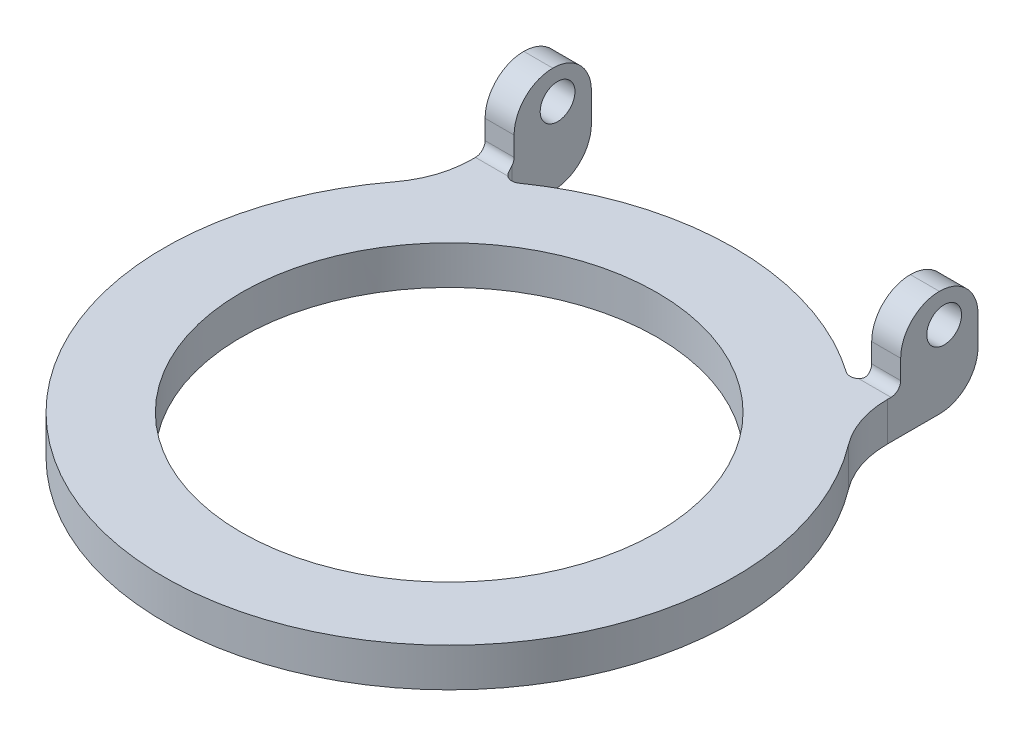
ISO-10303-21;
HEADER;
FILE_DESCRIPTION(('STEP AP214'),'2;1');
FILE_NAME('part.step','',(''),(''),'','','');
FILE_SCHEMA(('AUTOMOTIVE_DESIGN { 1 0 10303 214 1 1 1 1 }'));
ENDSEC;
DATA;
#1=APPLICATION_CONTEXT('core data for automotive mechanical design processes');
#2=APPLICATION_PROTOCOL_DEFINITION('international standard','automotive_design',2000,#1);
#3=PRODUCT_CONTEXT('',#1,'mechanical');
#4=PRODUCT('Part','Part','',(#3));
#5=PRODUCT_RELATED_PRODUCT_CATEGORY('part','',(#4));
#6=PRODUCT_DEFINITION_FORMATION('','',#4);
#7=PRODUCT_DEFINITION_CONTEXT('part definition',#1,'design');
#8=PRODUCT_DEFINITION('design','',#6,#7);
#9=PRODUCT_DEFINITION_SHAPE('','',#8);
#10=(LENGTH_UNIT() NAMED_UNIT(*) SI_UNIT(.MILLI.,.METRE.));
#11=(NAMED_UNIT(*) PLANE_ANGLE_UNIT() SI_UNIT($,.RADIAN.));
#12=(NAMED_UNIT(*) SI_UNIT($,.STERADIAN.) SOLID_ANGLE_UNIT());
#13=UNCERTAINTY_MEASURE_WITH_UNIT(LENGTH_MEASURE(1.E-05),#10,'distance_accuracy_value','');
#14=(GEOMETRIC_REPRESENTATION_CONTEXT(3) GLOBAL_UNCERTAINTY_ASSIGNED_CONTEXT((#13)) GLOBAL_UNIT_ASSIGNED_CONTEXT((#10,
#11,#12)) REPRESENTATION_CONTEXT('',''));
#15=CARTESIAN_POINT('',(0.,0.,0.));
#16=DIRECTION('',(0.,0.,1.));
#17=DIRECTION('',(1.,0.,0.));
#18=AXIS2_PLACEMENT_3D('',#15,#16,#17);
#19=CARTESIAN_POINT('',(0.,4.,0.));
#20=DIRECTION('',(0.,1.,0.));
#21=DIRECTION('',(0.,0.,1.));
#22=AXIS2_PLACEMENT_3D('',#19,#20,#21);
#23=PLANE('',#22);
#24=CARTESIAN_POINT('',(0.,4.,0.));
#25=DIRECTION('',(0.,1.,0.));
#26=DIRECTION('',(0.,0.,1.));
#27=AXIS2_PLACEMENT_3D('',#24,#25,#26);
#28=CIRCLE('',#27,21.5);
#29=CARTESIAN_POINT('',(0.,4.,21.5));
#30=VERTEX_POINT('',#29);
#31=EDGE_CURVE('E293',#30,#30,#28,.T.);
#32=ORIENTED_EDGE('',*,*,#31,.F.);
#33=EDGE_LOOP('',(#32));
#34=FACE_BOUND('',#33,.T.);
#35=CARTESIAN_POINT('',(-17.5,4.,-24.9799919935936));
#36=DIRECTION('',(0.,1.,0.));
#37=DIRECTION('',(0.,0.,1.));
#38=AXIS2_PLACEMENT_3D('',#35,#36,#37);
#39=CIRCLE('',#38,1.);
#40=CARTESIAN_POINT('',(-16.9262295081967,4.,-24.1609758626561));
#41=VERTEX_POINT('',#40);
#42=CARTESIAN_POINT('',(-18.1418997642347,4.,-24.2132034355964));
#43=VERTEX_POINT('',#42);
#44=EDGE_CURVE('E335',#41,#43,#39,.F.);
#45=ORIENTED_EDGE('',*,*,#44,.T.);
#46=DIRECTION('',(1.,0.,0.));
#47=VECTOR('',#46,1.);
#48=CARTESIAN_POINT('',(0.,4.,-24.2132034355964));
#49=LINE('',#48,#47);
#50=CARTESIAN_POINT('',(-21.5,4.,-24.2132034355964));
#51=VERTEX_POINT('',#50);
#52=EDGE_CURVE('E351',#43,#51,#49,.F.);
#53=ORIENTED_EDGE('',*,*,#52,.T.);
#54=DIRECTION('',(0.,0.,1.));
#55=VECTOR('',#54,1.);
#56=CARTESIAN_POINT('',(-21.5,4.,0.));
#57=LINE('',#56,#55);
#58=CARTESIAN_POINT('',(-21.5,4.,-23.832750575626));
#59=VERTEX_POINT('',#58);
#60=EDGE_CURVE('E402',#51,#59,#57,.T.);
#61=ORIENTED_EDGE('',*,*,#60,.T.);
#62=CARTESIAN_POINT('',(-31.5,4.,-23.832750575626));
#63=DIRECTION('',(0.,1.,0.));
#64=DIRECTION('',(0.,0.,1.));
#65=AXIS2_PLACEMENT_3D('',#62,#63,#64);
#66=CIRCLE('',#65,10.);
#67=CARTESIAN_POINT('',(-23.5253164556962,4.,-17.7991428349612));
#68=VERTEX_POINT('',#67);
#69=EDGE_CURVE('E318',#59,#68,#66,.F.);
#70=ORIENTED_EDGE('',*,*,#69,.T.);
#71=CARTESIAN_POINT('',(0.,4.,0.));
#72=DIRECTION('',(0.,1.,0.));
#73=DIRECTION('',(0.,0.,1.));
#74=AXIS2_PLACEMENT_3D('',#71,#72,#73);
#75=CIRCLE('',#74,29.5);
#76=CARTESIAN_POINT('',(23.5253164556962,4.,-17.7991428349612));
#77=VERTEX_POINT('',#76);
#78=EDGE_CURVE('E432',#68,#77,#75,.T.);
#79=ORIENTED_EDGE('',*,*,#78,.T.);
#80=CARTESIAN_POINT('',(31.5,4.,-23.832750575626));
#81=DIRECTION('',(0.,1.,0.));
#82=DIRECTION('',(0.,0.,1.));
#83=AXIS2_PLACEMENT_3D('',#80,#81,#82);
#84=CIRCLE('',#83,10.);
#85=CARTESIAN_POINT('',(21.5,4.,-23.832750575626));
#86=VERTEX_POINT('',#85);
#87=EDGE_CURVE('E311',#77,#86,#84,.F.);
#88=ORIENTED_EDGE('',*,*,#87,.T.);
#89=DIRECTION('',(0.,0.,1.));
#90=VECTOR('',#89,1.);
#91=CARTESIAN_POINT('',(21.5,4.,0.));
#92=LINE('',#91,#90);
#93=CARTESIAN_POINT('',(21.5,4.,-24.2132034355964));
#94=VERTEX_POINT('',#93);
#95=EDGE_CURVE('E435',#94,#86,#92,.T.);
#96=ORIENTED_EDGE('',*,*,#95,.F.);
#97=DIRECTION('',(1.,0.,0.));
#98=VECTOR('',#97,1.);
#99=CARTESIAN_POINT('',(0.,4.,-24.2132034355964));
#100=LINE('',#99,#98);
#101=CARTESIAN_POINT('',(18.1418997642347,4.,-24.2132034355964));
#102=VERTEX_POINT('',#101);
#103=EDGE_CURVE('E348',#94,#102,#100,.F.);
#104=ORIENTED_EDGE('',*,*,#103,.T.);
#105=CARTESIAN_POINT('',(17.5,4.,-24.9799919935936));
#106=DIRECTION('',(0.,1.,0.));
#107=DIRECTION('',(0.,0.,1.));
#108=AXIS2_PLACEMENT_3D('',#105,#106,#107);
#109=CIRCLE('',#108,1.);
#110=CARTESIAN_POINT('',(16.9262295081967,4.,-24.1609758626561));
#111=VERTEX_POINT('',#110);
#112=EDGE_CURVE('E341',#102,#111,#109,.F.);
#113=ORIENTED_EDGE('',*,*,#112,.T.);
#114=EDGE_CURVE('E219',#111,#41,#75,.T.);
#115=ORIENTED_EDGE('',*,*,#114,.T.);
#116=EDGE_LOOP('',(#45,#53,#61,#70,#79,#88,#96,#104,#113,#115));
#117=FACE_BOUND('',#116,.T.);
#118=ADVANCED_FACE('F47',(#34,#117),#23,.T.);
#119=CARTESIAN_POINT('',(0.,4.,0.));
#120=DIRECTION('',(0.,-1.,0.));
#121=DIRECTION('',(0.,0.,-1.));
#122=AXIS2_PLACEMENT_3D('',#119,#120,#121);
#123=CYLINDRICAL_SURFACE('',#122,29.5);
#124=CARTESIAN_POINT('',(0.,0.,0.));
#125=DIRECTION('',(0.,1.,0.));
#126=DIRECTION('',(0.,0.,1.));
#127=AXIS2_PLACEMENT_3D('',#124,#125,#126);
#128=CIRCLE('',#127,29.5);
#129=CARTESIAN_POINT('',(16.9262295081967,0.,-24.1609758626561));
#130=VERTEX_POINT('',#129);
#131=CARTESIAN_POINT('',(-16.9262295081967,0.,-24.1609758626561));
#132=VERTEX_POINT('',#131);
#133=EDGE_CURVE('E411',#130,#132,#128,.T.);
#134=ORIENTED_EDGE('',*,*,#133,.T.);
#135=DIRECTION('',(0.,-1.,0.));
#136=VECTOR('',#135,1.);
#137=CARTESIAN_POINT('',(-16.9262295081967,4.,-24.1609758626561));
#138=LINE('',#137,#136);
#139=EDGE_CURVE('E327',#132,#41,#138,.F.);
#140=ORIENTED_EDGE('',*,*,#139,.T.);
#141=ORIENTED_EDGE('',*,*,#114,.F.);
#142=DIRECTION('',(0.,-1.,0.));
#143=VECTOR('',#142,1.);
#144=CARTESIAN_POINT('',(16.9262295081967,4.,-24.1609758626561));
#145=LINE('',#144,#143);
#146=EDGE_CURVE('E323',#111,#130,#145,.T.);
#147=ORIENTED_EDGE('',*,*,#146,.T.);
#148=EDGE_LOOP('',(#134,#140,#141,#147));
#149=FACE_BOUND('',#148,.T.);
#150=ADVANCED_FACE('F550',(#149),#123,.T.);
#151=CARTESIAN_POINT('',(-18.5,4.,0.));
#152=DIRECTION('',(1.,0.,0.));
#153=DIRECTION('',(0.,0.,-1.));
#154=AXIS2_PLACEMENT_3D('',#151,#152,#153);
#155=PLANE('',#154);
#156=CARTESIAN_POINT('',(-18.5,7.75,-29.7132034355964));
#157=DIRECTION('',(1.,0.,0.));
#158=DIRECTION('',(0.,0.,-1.));
#159=AXIS2_PLACEMENT_3D('',#156,#157,#158);
#160=CIRCLE('',#159,1.8);
#161=CARTESIAN_POINT('',(-18.5,7.75,-31.5132034355964));
#162=VERTEX_POINT('',#161);
#163=EDGE_CURVE('E471',#162,#162,#160,.T.);
#164=ORIENTED_EDGE('',*,*,#163,.F.);
#165=EDGE_LOOP('',(#164));
#166=FACE_BOUND('',#165,.T.);
#167=DIRECTION('',(0.,-1.,0.));
#168=VECTOR('',#167,1.);
#169=CARTESIAN_POINT('',(-18.5,11.,-25.2132034355964));
#170=LINE('',#169,#168);
#171=CARTESIAN_POINT('',(-18.5,7.,-25.2132034355964));
#172=VERTEX_POINT('',#171);
#173=CARTESIAN_POINT('',(-18.5,5.,-25.2132034355964));
#174=VERTEX_POINT('',#173);
#175=EDGE_CURVE('E412',#172,#174,#170,.T.);
#176=ORIENTED_EDGE('',*,*,#175,.T.);
#177=CARTESIAN_POINT('',(-18.5,5.,-24.2132034355964));
#178=DIRECTION('',(1.,0.,0.));
#179=DIRECTION('',(0.,0.,-1.));
#180=AXIS2_PLACEMENT_3D('',#177,#178,#179);
#181=CIRCLE('',#180,1.);
#182=CARTESIAN_POINT('',(-18.5,4.35810023576526,-24.9799919935936));
#183=VERTEX_POINT('',#182);
#184=EDGE_CURVE('E358',#174,#183,#181,.F.);
#185=ORIENTED_EDGE('',*,*,#184,.T.);
#186=DIRECTION('',(0.,-1.,0.));
#187=VECTOR('',#186,1.);
#188=CARTESIAN_POINT('',(-18.5,4.,-24.9799919935936));
#189=LINE('',#188,#187);
#190=CARTESIAN_POINT('',(-18.5,0.,-24.9799919935936));
#191=VERTEX_POINT('',#190);
#192=EDGE_CURVE('E71',#183,#191,#189,.T.);
#193=ORIENTED_EDGE('',*,*,#192,.T.);
#194=DIRECTION('',(0.,0.,1.));
#195=VECTOR('',#194,1.);
#196=CARTESIAN_POINT('',(-18.5,0.,0.));
#197=LINE('',#196,#195);
#198=CARTESIAN_POINT('',(-18.5,0.,-29.2132034355964));
#199=VERTEX_POINT('',#198);
#200=EDGE_CURVE('E441',#199,#191,#197,.T.);
#201=ORIENTED_EDGE('',*,*,#200,.F.);
#202=CARTESIAN_POINT('',(-18.5,4.,-29.2132034355964));
#203=DIRECTION('',(1.,0.,0.));
#204=DIRECTION('',(0.,0.,-1.));
#205=AXIS2_PLACEMENT_3D('',#202,#203,#204);
#206=CIRCLE('',#205,4.);
#207=CARTESIAN_POINT('',(-18.5,4.,-33.2132034355964));
#208=VERTEX_POINT('',#207);
#209=EDGE_CURVE('E272',#199,#208,#206,.T.);
#210=ORIENTED_EDGE('',*,*,#209,.T.);
#211=DIRECTION('',(0.,-1.,0.));
#212=VECTOR('',#211,1.);
#213=CARTESIAN_POINT('',(-18.5,4.,-33.2132034355964));
#214=LINE('',#213,#212);
#215=CARTESIAN_POINT('',(-18.5,7.,-33.2132034355964));
#216=VERTEX_POINT('',#215);
#217=EDGE_CURVE('E232',#216,#208,#214,.T.);
#218=ORIENTED_EDGE('',*,*,#217,.F.);
#219=CARTESIAN_POINT('',(-18.5,7.,-29.2132034355964));
#220=DIRECTION('',(1.,0.,0.));
#221=DIRECTION('',(0.,0.,-1.));
#222=AXIS2_PLACEMENT_3D('',#219,#220,#221);
#223=CIRCLE('',#222,4.);
#224=CARTESIAN_POINT('',(-18.5,11.,-29.2132034355964));
#225=VERTEX_POINT('',#224);
#226=EDGE_CURVE('E266',#216,#225,#223,.T.);
#227=ORIENTED_EDGE('',*,*,#226,.T.);
#228=CARTESIAN_POINT('',(-18.5,7.,-29.2132034355964));
#229=DIRECTION('',(1.,0.,0.));
#230=DIRECTION('',(0.,0.,-1.));
#231=AXIS2_PLACEMENT_3D('',#228,#229,#230);
#232=CIRCLE('',#231,4.);
#233=EDGE_CURVE('E269',#225,#172,#232,.T.);
#234=ORIENTED_EDGE('',*,*,#233,.T.);
#235=EDGE_LOOP('',(#176,#185,#193,#201,#210,#218,#227,#234));
#236=FACE_BOUND('',#235,.T.);
#237=ADVANCED_FACE('F416',(#166,#236),#155,.T.);
#238=CARTESIAN_POINT('',(0.,4.,-33.2132034355964));
#239=DIRECTION('',(0.,0.,1.));
#240=DIRECTION('',(1.,0.,0.));
#241=AXIS2_PLACEMENT_3D('',#238,#239,#240);
#242=PLANE('',#241);
#243=ORIENTED_EDGE('',*,*,#217,.T.);
#244=DIRECTION('',(-1.,0.,0.));
#245=VECTOR('',#244,1.);
#246=CARTESIAN_POINT('',(0.,4.,-33.2132034355964));
#247=LINE('',#246,#245);
#248=CARTESIAN_POINT('',(-21.5,4.,-33.2132034355964));
#249=VERTEX_POINT('',#248);
#250=EDGE_CURVE('E253',#208,#249,#247,.T.);
#251=ORIENTED_EDGE('',*,*,#250,.T.);
#252=DIRECTION('',(0.,-1.,0.));
#253=VECTOR('',#252,1.);
#254=CARTESIAN_POINT('',(-21.5,4.,-33.2132034355964));
#255=LINE('',#254,#253);
#256=CARTESIAN_POINT('',(-21.5,7.,-33.2132034355964));
#257=VERTEX_POINT('',#256);
#258=EDGE_CURVE('E456',#257,#249,#255,.T.);
#259=ORIENTED_EDGE('',*,*,#258,.F.);
#260=DIRECTION('',(-1.,0.,0.));
#261=VECTOR('',#260,1.);
#262=CARTESIAN_POINT('',(-18.5,7.,-33.2132034355964));
#263=LINE('',#262,#261);
#264=EDGE_CURVE('E207',#257,#216,#263,.F.);
#265=ORIENTED_EDGE('',*,*,#264,.T.);
#266=EDGE_LOOP('',(#243,#251,#259,#265));
#267=FACE_BOUND('',#266,.T.);
#268=ADVANCED_FACE('F530',(#267),#242,.F.);
#269=CARTESIAN_POINT('',(-21.5,4.,0.));
#270=DIRECTION('',(1.,0.,0.));
#271=DIRECTION('',(0.,0.,-1.));
#272=AXIS2_PLACEMENT_3D('',#269,#270,#271);
#273=PLANE('',#272);
#274=CARTESIAN_POINT('',(-21.5,7.75,-29.7132034355964));
#275=DIRECTION('',(-1.,0.,0.));
#276=DIRECTION('',(0.,0.,1.));
#277=AXIS2_PLACEMENT_3D('',#274,#275,#276);
#278=CIRCLE('',#277,1.8);
#279=CARTESIAN_POINT('',(-21.5,7.75,-27.9132034355964));
#280=VERTEX_POINT('',#279);
#281=EDGE_CURVE('E288',#280,#280,#278,.T.);
#282=ORIENTED_EDGE('',*,*,#281,.F.);
#283=EDGE_LOOP('',(#282));
#284=FACE_BOUND('',#283,.T.);
#285=DIRECTION('',(0.,0.,1.));
#286=VECTOR('',#285,1.);
#287=CARTESIAN_POINT('',(-21.5,0.,0.));
#288=LINE('',#287,#286);
#289=CARTESIAN_POINT('',(-21.5,0.,-29.2132034355964));
#290=VERTEX_POINT('',#289);
#291=CARTESIAN_POINT('',(-21.5,0.,-23.832750575626));
#292=VERTEX_POINT('',#291);
#293=EDGE_CURVE('E445',#290,#292,#288,.T.);
#294=ORIENTED_EDGE('',*,*,#293,.T.);
#295=DIRECTION('',(0.,1.,0.));
#296=VECTOR('',#295,1.);
#297=CARTESIAN_POINT('',(-21.5,4.,-23.832750575626));
#298=LINE('',#297,#296);
#299=EDGE_CURVE('E304',#292,#59,#298,.T.);
#300=ORIENTED_EDGE('',*,*,#299,.T.);
#301=ORIENTED_EDGE('',*,*,#60,.F.);
#302=CARTESIAN_POINT('',(-21.5,5.,-24.2132034355964));
#303=DIRECTION('',(1.,0.,0.));
#304=DIRECTION('',(0.,0.,-1.));
#305=AXIS2_PLACEMENT_3D('',#302,#303,#304);
#306=CIRCLE('',#305,1.);
#307=CARTESIAN_POINT('',(-21.5,5.,-25.2132034355964));
#308=VERTEX_POINT('',#307);
#309=EDGE_CURVE('E369',#51,#308,#306,.T.);
#310=ORIENTED_EDGE('',*,*,#309,.T.);
#311=DIRECTION('',(0.,-1.,0.));
#312=VECTOR('',#311,1.);
#313=CARTESIAN_POINT('',(-21.5,11.,-25.2132034355964));
#314=LINE('',#313,#312);
#315=CARTESIAN_POINT('',(-21.5,7.,-25.2132034355964));
#316=VERTEX_POINT('',#315);
#317=EDGE_CURVE('E401',#316,#308,#314,.T.);
#318=ORIENTED_EDGE('',*,*,#317,.F.);
#319=CARTESIAN_POINT('',(-21.5,7.,-29.2132034355964));
#320=DIRECTION('',(1.,0.,0.));
#321=DIRECTION('',(0.,0.,-1.));
#322=AXIS2_PLACEMENT_3D('',#319,#320,#321);
#323=CIRCLE('',#322,4.);
#324=CARTESIAN_POINT('',(-21.5,11.,-29.2132034355964));
#325=VERTEX_POINT('',#324);
#326=EDGE_CURVE('E260',#316,#325,#323,.F.);
#327=ORIENTED_EDGE('',*,*,#326,.T.);
#328=CARTESIAN_POINT('',(-21.5,7.,-29.2132034355964));
#329=DIRECTION('',(1.,0.,0.));
#330=DIRECTION('',(0.,0.,-1.));
#331=AXIS2_PLACEMENT_3D('',#328,#329,#330);
#332=CIRCLE('',#331,4.);
#333=EDGE_CURVE('E257',#325,#257,#332,.F.);
#334=ORIENTED_EDGE('',*,*,#333,.T.);
#335=ORIENTED_EDGE('',*,*,#258,.T.);
#336=CARTESIAN_POINT('',(-21.5,4.,-29.2132034355964));
#337=DIRECTION('',(1.,0.,0.));
#338=DIRECTION('',(0.,0.,-1.));
#339=AXIS2_PLACEMENT_3D('',#336,#337,#338);
#340=CIRCLE('',#339,4.);
#341=EDGE_CURVE('E263',#249,#290,#340,.F.);
#342=ORIENTED_EDGE('',*,*,#341,.T.);
#343=EDGE_LOOP('',(#294,#300,#301,#310,#318,#327,#334,#335,#342));
#344=FACE_BOUND('',#343,.T.);
#345=ADVANCED_FACE('F400',(#284,#344),#273,.F.);
#346=CARTESIAN_POINT('',(-23.5253164556962,0.,-17.7991428349612));
#347=VERTEX_POINT('',#346);
#348=CARTESIAN_POINT('',(23.5253164556962,0.,-17.7991428349612));
#349=VERTEX_POINT('',#348);
#350=EDGE_CURVE('E442',#347,#349,#128,.T.);
#351=ORIENTED_EDGE('',*,*,#350,.T.);
#352=DIRECTION('',(0.,-1.,0.));
#353=VECTOR('',#352,1.);
#354=CARTESIAN_POINT('',(23.5253164556962,4.,-17.7991428349612));
#355=LINE('',#354,#353);
#356=EDGE_CURVE('E301',#349,#77,#355,.F.);
#357=ORIENTED_EDGE('',*,*,#356,.T.);
#358=ORIENTED_EDGE('',*,*,#78,.F.);
#359=DIRECTION('',(0.,-1.,0.));
#360=VECTOR('',#359,1.);
#361=CARTESIAN_POINT('',(-23.5253164556962,4.,-17.7991428349612));
#362=LINE('',#361,#360);
#363=EDGE_CURVE('E297',#68,#347,#362,.T.);
#364=ORIENTED_EDGE('',*,*,#363,.T.);
#365=EDGE_LOOP('',(#351,#357,#358,#364));
#366=FACE_BOUND('',#365,.T.);
#367=ADVANCED_FACE('F508',(#366),#123,.T.);
#368=CARTESIAN_POINT('',(21.5,4.,0.));
#369=DIRECTION('',(1.,0.,0.));
#370=DIRECTION('',(0.,0.,-1.));
#371=AXIS2_PLACEMENT_3D('',#368,#369,#370);
#372=PLANE('',#371);
#373=CARTESIAN_POINT('',(21.5,7.75,-29.7132034355964));
#374=DIRECTION('',(1.,0.,0.));
#375=DIRECTION('',(0.,0.,-1.));
#376=AXIS2_PLACEMENT_3D('',#373,#374,#375);
#377=CIRCLE('',#376,1.8);
#378=CARTESIAN_POINT('',(21.5,7.75,-31.5132034355964));
#379=VERTEX_POINT('',#378);
#380=EDGE_CURVE('E465',#379,#379,#377,.T.);
#381=ORIENTED_EDGE('',*,*,#380,.F.);
#382=EDGE_LOOP('',(#381));
#383=FACE_BOUND('',#382,.T.);
#384=DIRECTION('',(0.,-1.,0.));
#385=VECTOR('',#384,1.);
#386=CARTESIAN_POINT('',(21.5,11.,-25.2132034355964));
#387=LINE('',#386,#385);
#388=CARTESIAN_POINT('',(21.5,7.,-25.2132034355964));
#389=VERTEX_POINT('',#388);
#390=CARTESIAN_POINT('',(21.5,5.,-25.2132034355964));
#391=VERTEX_POINT('',#390);
#392=EDGE_CURVE('E425',#389,#391,#387,.T.);
#393=ORIENTED_EDGE('',*,*,#392,.T.);
#394=CARTESIAN_POINT('',(21.5,5.,-24.2132034355964));
#395=DIRECTION('',(1.,0.,0.));
#396=DIRECTION('',(0.,0.,-1.));
#397=AXIS2_PLACEMENT_3D('',#394,#395,#396);
#398=CIRCLE('',#397,1.);
#399=EDGE_CURVE('E388',#391,#94,#398,.F.);
#400=ORIENTED_EDGE('',*,*,#399,.T.);
#401=ORIENTED_EDGE('',*,*,#95,.T.);
#402=DIRECTION('',(0.,-1.,0.));
#403=VECTOR('',#402,1.);
#404=CARTESIAN_POINT('',(21.5,4.,-23.832750575626));
#405=LINE('',#404,#403);
#406=CARTESIAN_POINT('',(21.5,0.,-23.832750575626));
#407=VERTEX_POINT('',#406);
#408=EDGE_CURVE('E283',#86,#407,#405,.T.);
#409=ORIENTED_EDGE('',*,*,#408,.T.);
#410=DIRECTION('',(0.,0.,1.));
#411=VECTOR('',#410,1.);
#412=CARTESIAN_POINT('',(21.5,0.,0.));
#413=LINE('',#412,#411);
#414=CARTESIAN_POINT('',(21.5,0.,-29.2132034355964));
#415=VERTEX_POINT('',#414);
#416=EDGE_CURVE('E220',#415,#407,#413,.T.);
#417=ORIENTED_EDGE('',*,*,#416,.F.);
#418=CARTESIAN_POINT('',(21.5,4.,-29.2132034355964));
#419=DIRECTION('',(1.,0.,0.));
#420=DIRECTION('',(0.,0.,-1.));
#421=AXIS2_PLACEMENT_3D('',#418,#419,#420);
#422=CIRCLE('',#421,4.);
#423=CARTESIAN_POINT('',(21.5,4.,-33.2132034355964));
#424=VERTEX_POINT('',#423);
#425=EDGE_CURVE('E223',#415,#424,#422,.T.);
#426=ORIENTED_EDGE('',*,*,#425,.T.);
#427=DIRECTION('',(0.,-1.,0.));
#428=VECTOR('',#427,1.);
#429=CARTESIAN_POINT('',(21.5,4.,-33.2132034355964));
#430=LINE('',#429,#428);
#431=CARTESIAN_POINT('',(21.5,7.,-33.2132034355964));
#432=VERTEX_POINT('',#431);
#433=EDGE_CURVE('E452',#432,#424,#430,.T.);
#434=ORIENTED_EDGE('',*,*,#433,.F.);
#435=CARTESIAN_POINT('',(21.5,7.,-29.2132034355964));
#436=DIRECTION('',(1.,0.,0.));
#437=DIRECTION('',(0.,0.,-1.));
#438=AXIS2_PLACEMENT_3D('',#435,#436,#437);
#439=CIRCLE('',#438,4.);
#440=CARTESIAN_POINT('',(21.5,11.,-29.2132034355964));
#441=VERTEX_POINT('',#440);
#442=EDGE_CURVE('E225',#432,#441,#439,.T.);
#443=ORIENTED_EDGE('',*,*,#442,.T.);
#444=CARTESIAN_POINT('',(21.5,7.,-29.2132034355964));
#445=DIRECTION('',(1.,0.,0.));
#446=DIRECTION('',(0.,0.,-1.));
#447=AXIS2_PLACEMENT_3D('',#444,#445,#446);
#448=CIRCLE('',#447,4.);
#449=EDGE_CURVE('E230',#441,#389,#448,.T.);
#450=ORIENTED_EDGE('',*,*,#449,.T.);
#451=EDGE_LOOP('',(#393,#400,#401,#409,#417,#426,#434,#443,#450));
#452=FACE_BOUND('',#451,.T.);
#453=ADVANCED_FACE('F484',(#383,#452),#372,.T.);
#454=CARTESIAN_POINT('',(0.,4.,-33.2132034355964));
#455=DIRECTION('',(0.,0.,-1.));
#456=DIRECTION('',(-1.,0.,0.));
#457=AXIS2_PLACEMENT_3D('',#454,#455,#456);
#458=PLANE('',#457);
#459=ORIENTED_EDGE('',*,*,#433,.T.);
#460=DIRECTION('',(1.,0.,0.));
#461=VECTOR('',#460,1.);
#462=CARTESIAN_POINT('',(18.5,4.,-33.2132034355964));
#463=LINE('',#462,#461);
#464=CARTESIAN_POINT('',(18.5,4.,-33.2132034355964));
#465=VERTEX_POINT('',#464);
#466=EDGE_CURVE('E243',#424,#465,#463,.F.);
#467=ORIENTED_EDGE('',*,*,#466,.T.);
#468=DIRECTION('',(0.,-1.,0.));
#469=VECTOR('',#468,1.);
#470=CARTESIAN_POINT('',(18.5,4.,-33.2132034355964));
#471=LINE('',#470,#469);
#472=CARTESIAN_POINT('',(18.5,7.,-33.2132034355964));
#473=VERTEX_POINT('',#472);
#474=EDGE_CURVE('E202',#473,#465,#471,.T.);
#475=ORIENTED_EDGE('',*,*,#474,.F.);
#476=DIRECTION('',(-1.,0.,0.));
#477=VECTOR('',#476,1.);
#478=CARTESIAN_POINT('',(0.,7.,-33.2132034355964));
#479=LINE('',#478,#477);
#480=EDGE_CURVE('E240',#473,#432,#479,.F.);
#481=ORIENTED_EDGE('',*,*,#480,.T.);
#482=EDGE_LOOP('',(#459,#467,#475,#481));
#483=FACE_BOUND('',#482,.T.);
#484=ADVANCED_FACE('F501',(#483),#458,.T.);
#485=CARTESIAN_POINT('',(18.5,4.,0.));
#486=DIRECTION('',(1.,0.,0.));
#487=DIRECTION('',(0.,0.,-1.));
#488=AXIS2_PLACEMENT_3D('',#485,#486,#487);
#489=PLANE('',#488);
#490=CARTESIAN_POINT('',(18.5,7.75,-29.7132034355964));
#491=DIRECTION('',(1.,0.,0.));
#492=DIRECTION('',(0.,0.,-1.));
#493=AXIS2_PLACEMENT_3D('',#490,#491,#492);
#494=CIRCLE('',#493,1.8);
#495=CARTESIAN_POINT('',(18.5,7.75,-31.5132034355964));
#496=VERTEX_POINT('',#495);
#497=EDGE_CURVE('E462',#496,#496,#494,.T.);
#498=ORIENTED_EDGE('',*,*,#497,.T.);
#499=EDGE_LOOP('',(#498));
#500=FACE_BOUND('',#499,.T.);
#501=DIRECTION('',(0.,0.,1.));
#502=VECTOR('',#501,1.);
#503=CARTESIAN_POINT('',(18.5,0.,0.));
#504=LINE('',#503,#502);
#505=CARTESIAN_POINT('',(18.5,0.,-29.2132034355964));
#506=VERTEX_POINT('',#505);
#507=CARTESIAN_POINT('',(18.5,0.,-24.9799919935936));
#508=VERTEX_POINT('',#507);
#509=EDGE_CURVE('E200',#506,#508,#504,.T.);
#510=ORIENTED_EDGE('',*,*,#509,.T.);
#511=DIRECTION('',(0.,1.,0.));
#512=VECTOR('',#511,1.);
#513=CARTESIAN_POINT('',(18.5,4.,-24.9799919935936));
#514=LINE('',#513,#512);
#515=CARTESIAN_POINT('',(18.5,4.35810023576526,-24.9799919935936));
#516=VERTEX_POINT('',#515);
#517=EDGE_CURVE('E63',#508,#516,#514,.T.);
#518=ORIENTED_EDGE('',*,*,#517,.T.);
#519=CARTESIAN_POINT('',(18.5,5.,-24.2132034355964));
#520=DIRECTION('',(1.,0.,0.));
#521=DIRECTION('',(0.,0.,-1.));
#522=AXIS2_PLACEMENT_3D('',#519,#520,#521);
#523=CIRCLE('',#522,1.);
#524=CARTESIAN_POINT('',(18.5,5.,-25.2132034355964));
#525=VERTEX_POINT('',#524);
#526=EDGE_CURVE('E12',#516,#525,#523,.T.);
#527=ORIENTED_EDGE('',*,*,#526,.T.);
#528=DIRECTION('',(0.,-1.,0.));
#529=VECTOR('',#528,1.);
#530=CARTESIAN_POINT('',(18.5,11.,-25.2132034355964));
#531=LINE('',#530,#529);
#532=CARTESIAN_POINT('',(18.5,7.,-25.2132034355964));
#533=VERTEX_POINT('',#532);
#534=EDGE_CURVE('E421',#533,#525,#531,.T.);
#535=ORIENTED_EDGE('',*,*,#534,.F.);
#536=CARTESIAN_POINT('',(18.5,7.,-29.2132034355964));
#537=DIRECTION('',(1.,0.,0.));
#538=DIRECTION('',(0.,0.,-1.));
#539=AXIS2_PLACEMENT_3D('',#536,#537,#538);
#540=CIRCLE('',#539,4.);
#541=CARTESIAN_POINT('',(18.5,11.,-29.2132034355964));
#542=VERTEX_POINT('',#541);
#543=EDGE_CURVE('E208',#533,#542,#540,.F.);
#544=ORIENTED_EDGE('',*,*,#543,.T.);
#545=CARTESIAN_POINT('',(18.5,7.,-29.2132034355964));
#546=DIRECTION('',(1.,0.,0.));
#547=DIRECTION('',(0.,0.,-1.));
#548=AXIS2_PLACEMENT_3D('',#545,#546,#547);
#549=CIRCLE('',#548,4.);
#550=EDGE_CURVE('E246',#542,#473,#549,.F.);
#551=ORIENTED_EDGE('',*,*,#550,.T.);
#552=ORIENTED_EDGE('',*,*,#474,.T.);
#553=CARTESIAN_POINT('',(18.5,4.,-29.2132034355964));
#554=DIRECTION('',(1.,0.,0.));
#555=DIRECTION('',(0.,0.,-1.));
#556=AXIS2_PLACEMENT_3D('',#553,#554,#555);
#557=CIRCLE('',#556,4.);
#558=EDGE_CURVE('E197',#465,#506,#557,.F.);
#559=ORIENTED_EDGE('',*,*,#558,.T.);
#560=EDGE_LOOP('',(#510,#518,#527,#535,#544,#551,#552,#559));
#561=FACE_BOUND('',#560,.T.);
#562=ADVANCED_FACE('F199',(#500,#561),#489,.F.);
#563=CARTESIAN_POINT('',(0.,0.,0.));
#564=DIRECTION('',(0.,1.,0.));
#565=DIRECTION('',(0.,0.,1.));
#566=AXIS2_PLACEMENT_3D('',#563,#564,#565);
#567=PLANE('',#566);
#568=CARTESIAN_POINT('',(0.,0.,0.));
#569=DIRECTION('',(0.,-1.,0.));
#570=DIRECTION('',(0.,0.,-1.));
#571=AXIS2_PLACEMENT_3D('',#568,#569,#570);
#572=CIRCLE('',#571,21.5);
#573=CARTESIAN_POINT('',(0.,0.,-21.5));
#574=VERTEX_POINT('',#573);
#575=EDGE_CURVE('E883',#574,#574,#572,.T.);
#576=ORIENTED_EDGE('',*,*,#575,.F.);
#577=EDGE_LOOP('',(#576));
#578=FACE_BOUND('',#577,.T.);
#579=ORIENTED_EDGE('',*,*,#509,.F.);
#580=DIRECTION('',(1.,0.,0.));
#581=VECTOR('',#580,1.);
#582=CARTESIAN_POINT('',(21.5,0.,-29.2132034355964));
#583=LINE('',#582,#581);
#584=EDGE_CURVE('E214',#506,#415,#583,.T.);
#585=ORIENTED_EDGE('',*,*,#584,.T.);
#586=ORIENTED_EDGE('',*,*,#416,.T.);
#587=CARTESIAN_POINT('',(31.5,0.,-23.832750575626));
#588=DIRECTION('',(0.,1.,0.));
#589=DIRECTION('',(0.,0.,1.));
#590=AXIS2_PLACEMENT_3D('',#587,#588,#589);
#591=CIRCLE('',#590,10.);
#592=EDGE_CURVE('E308',#407,#349,#591,.T.);
#593=ORIENTED_EDGE('',*,*,#592,.T.);
#594=ORIENTED_EDGE('',*,*,#350,.F.);
#595=CARTESIAN_POINT('',(-31.5,0.,-23.832750575626));
#596=DIRECTION('',(0.,1.,0.));
#597=DIRECTION('',(0.,0.,1.));
#598=AXIS2_PLACEMENT_3D('',#595,#596,#597);
#599=CIRCLE('',#598,10.);
#600=EDGE_CURVE('E315',#347,#292,#599,.T.);
#601=ORIENTED_EDGE('',*,*,#600,.T.);
#602=ORIENTED_EDGE('',*,*,#293,.F.);
#603=DIRECTION('',(-1.,0.,0.));
#604=VECTOR('',#603,1.);
#605=CARTESIAN_POINT('',(0.,0.,-29.2132034355964));
#606=LINE('',#605,#604);
#607=EDGE_CURVE('E226',#290,#199,#606,.F.);
#608=ORIENTED_EDGE('',*,*,#607,.T.);
#609=ORIENTED_EDGE('',*,*,#200,.T.);
#610=CARTESIAN_POINT('',(-17.5,0.,-24.9799919935936));
#611=DIRECTION('',(0.,1.,0.));
#612=DIRECTION('',(0.,0.,1.));
#613=AXIS2_PLACEMENT_3D('',#610,#611,#612);
#614=CIRCLE('',#613,1.);
#615=EDGE_CURVE('E332',#191,#132,#614,.T.);
#616=ORIENTED_EDGE('',*,*,#615,.T.);
#617=ORIENTED_EDGE('',*,*,#133,.F.);
#618=CARTESIAN_POINT('',(17.5,0.,-24.9799919935936));
#619=DIRECTION('',(0.,1.,0.));
#620=DIRECTION('',(0.,0.,1.));
#621=AXIS2_PLACEMENT_3D('',#618,#619,#620);
#622=CIRCLE('',#621,1.);
#623=EDGE_CURVE('E217',#130,#508,#622,.T.);
#624=ORIENTED_EDGE('',*,*,#623,.T.);
#625=EDGE_LOOP('',(#579,#585,#586,#593,#594,#601,#602,#608,#609,#616,#617,#624));
#626=FACE_BOUND('',#625,.T.);
#627=ADVANCED_FACE('F212',(#578,#626),#567,.F.);
#628=CARTESIAN_POINT('',(0.,11.,-25.2132034355964));
#629=DIRECTION('',(0.,0.,-1.));
#630=DIRECTION('',(-1.,0.,0.));
#631=AXIS2_PLACEMENT_3D('',#628,#629,#630);
#632=PLANE('',#631);
#633=ORIENTED_EDGE('',*,*,#317,.T.);
#634=DIRECTION('',(1.,0.,0.));
#635=VECTOR('',#634,1.);
#636=CARTESIAN_POINT('',(0.,5.,-25.2132034355964));
#637=LINE('',#636,#635);
#638=EDGE_CURVE('E344',#308,#174,#637,.T.);
#639=ORIENTED_EDGE('',*,*,#638,.T.);
#640=ORIENTED_EDGE('',*,*,#175,.F.);
#641=DIRECTION('',(1.,0.,0.));
#642=VECTOR('',#641,1.);
#643=CARTESIAN_POINT('',(-21.5,7.,-25.2132034355964));
#644=LINE('',#643,#642);
#645=EDGE_CURVE('E275',#172,#316,#644,.F.);
#646=ORIENTED_EDGE('',*,*,#645,.T.);
#647=EDGE_LOOP('',(#633,#639,#640,#646));
#648=FACE_BOUND('',#647,.T.);
#649=ADVANCED_FACE('F406',(#648),#632,.F.);
#650=CARTESIAN_POINT('',(0.,11.,-25.2132034355964));
#651=DIRECTION('',(0.,0.,-1.));
#652=DIRECTION('',(-1.,0.,0.));
#653=AXIS2_PLACEMENT_3D('',#650,#651,#652);
#654=PLANE('',#653);
#655=ORIENTED_EDGE('',*,*,#534,.T.);
#656=DIRECTION('',(1.,0.,0.));
#657=VECTOR('',#656,1.);
#658=CARTESIAN_POINT('',(0.,5.,-25.2132034355964));
#659=LINE('',#658,#657);
#660=EDGE_CURVE('E354',#525,#391,#659,.T.);
#661=ORIENTED_EDGE('',*,*,#660,.T.);
#662=ORIENTED_EDGE('',*,*,#392,.F.);
#663=DIRECTION('',(1.,0.,0.));
#664=VECTOR('',#663,1.);
#665=CARTESIAN_POINT('',(18.5,7.,-25.2132034355964));
#666=LINE('',#665,#664);
#667=EDGE_CURVE('E279',#389,#533,#666,.F.);
#668=ORIENTED_EDGE('',*,*,#667,.T.);
#669=EDGE_LOOP('',(#655,#661,#662,#668));
#670=FACE_BOUND('',#669,.T.);
#671=ADVANCED_FACE('F488',(#670),#654,.F.);
#672=CARTESIAN_POINT('',(29.5,7.75,-29.7132034355964));
#673=DIRECTION('',(-1.,0.,0.));
#674=DIRECTION('',(0.,0.,1.));
#675=AXIS2_PLACEMENT_3D('',#672,#673,#674);
#676=CYLINDRICAL_SURFACE('',#675,1.8);
#677=ORIENTED_EDGE('',*,*,#380,.T.);
#678=EDGE_LOOP('',(#677));
#679=FACE_BOUND('',#678,.T.);
#680=ORIENTED_EDGE('',*,*,#497,.F.);
#681=EDGE_LOOP('',(#680));
#682=FACE_BOUND('',#681,.T.);
#683=ADVANCED_FACE('F698',(#679,#682),#676,.F.);
#684=ORIENTED_EDGE('',*,*,#163,.T.);
#685=EDGE_LOOP('',(#684));
#686=FACE_BOUND('',#685,.T.);
#687=ORIENTED_EDGE('',*,*,#281,.T.);
#688=EDGE_LOOP('',(#687));
#689=FACE_BOUND('',#688,.T.);
#690=ADVANCED_FACE('F582',(#686,#689),#676,.F.);
#691=CARTESIAN_POINT('',(0.,4.,-29.2132034355964));
#692=DIRECTION('',(-1.,0.,0.));
#693=DIRECTION('',(0.,0.,1.));
#694=AXIS2_PLACEMENT_3D('',#691,#692,#693);
#695=CYLINDRICAL_SURFACE('',#694,4.);
#696=ORIENTED_EDGE('',*,*,#558,.F.);
#697=ORIENTED_EDGE('',*,*,#466,.F.);
#698=ORIENTED_EDGE('',*,*,#425,.F.);
#699=ORIENTED_EDGE('',*,*,#584,.F.);
#700=EDGE_LOOP('',(#696,#697,#698,#699));
#701=FACE_BOUND('',#700,.T.);
#702=ADVANCED_FACE('F222',(#701),#695,.T.);
#703=CARTESIAN_POINT('',(0.,4.,-29.2132034355964));
#704=DIRECTION('',(-1.,0.,0.));
#705=DIRECTION('',(0.,0.,1.));
#706=AXIS2_PLACEMENT_3D('',#703,#704,#705);
#707=CYLINDRICAL_SURFACE('',#706,4.);
#708=ORIENTED_EDGE('',*,*,#209,.F.);
#709=ORIENTED_EDGE('',*,*,#607,.F.);
#710=ORIENTED_EDGE('',*,*,#341,.F.);
#711=ORIENTED_EDGE('',*,*,#250,.F.);
#712=EDGE_LOOP('',(#708,#709,#710,#711));
#713=FACE_BOUND('',#712,.T.);
#714=ADVANCED_FACE('F528',(#713),#707,.T.);
#715=CARTESIAN_POINT('',(0.,7.,-29.2132034355964));
#716=DIRECTION('',(1.,0.,0.));
#717=DIRECTION('',(0.,0.,-1.));
#718=AXIS2_PLACEMENT_3D('',#715,#716,#717);
#719=CYLINDRICAL_SURFACE('',#718,4.);
#720=ORIENTED_EDGE('',*,*,#264,.F.);
#721=ORIENTED_EDGE('',*,*,#333,.F.);
#722=DIRECTION('',(-1.,0.,0.));
#723=VECTOR('',#722,1.);
#724=CARTESIAN_POINT('',(-21.5,11.,-29.2132034355964));
#725=LINE('',#724,#723);
#726=EDGE_CURVE('E284',#225,#325,#725,.T.);
#727=ORIENTED_EDGE('',*,*,#726,.F.);
#728=ORIENTED_EDGE('',*,*,#226,.F.);
#729=EDGE_LOOP('',(#720,#721,#727,#728));
#730=FACE_BOUND('',#729,.T.);
#731=ADVANCED_FACE('F536',(#730),#719,.T.);
#732=CARTESIAN_POINT('',(0.,7.,-29.2132034355964));
#733=DIRECTION('',(-1.,0.,0.));
#734=DIRECTION('',(0.,0.,1.));
#735=AXIS2_PLACEMENT_3D('',#732,#733,#734);
#736=CYLINDRICAL_SURFACE('',#735,4.);
#737=ORIENTED_EDGE('',*,*,#326,.F.);
#738=ORIENTED_EDGE('',*,*,#645,.F.);
#739=ORIENTED_EDGE('',*,*,#233,.F.);
#740=ORIENTED_EDGE('',*,*,#726,.T.);
#741=EDGE_LOOP('',(#737,#738,#739,#740));
#742=FACE_BOUND('',#741,.T.);
#743=ADVANCED_FACE('F539',(#742),#736,.T.);
#744=CARTESIAN_POINT('',(0.,7.,-29.2132034355964));
#745=DIRECTION('',(-1.,0.,0.));
#746=DIRECTION('',(0.,0.,1.));
#747=AXIS2_PLACEMENT_3D('',#744,#745,#746);
#748=CYLINDRICAL_SURFACE('',#747,4.);
#749=ORIENTED_EDGE('',*,*,#480,.F.);
#750=ORIENTED_EDGE('',*,*,#550,.F.);
#751=DIRECTION('',(-1.,0.,0.));
#752=VECTOR('',#751,1.);
#753=CARTESIAN_POINT('',(0.,11.,-29.2132034355964));
#754=LINE('',#753,#752);
#755=EDGE_CURVE('E289',#441,#542,#754,.T.);
#756=ORIENTED_EDGE('',*,*,#755,.F.);
#757=ORIENTED_EDGE('',*,*,#442,.F.);
#758=EDGE_LOOP('',(#749,#750,#756,#757));
#759=FACE_BOUND('',#758,.T.);
#760=ADVANCED_FACE('F497',(#759),#748,.T.);
#761=CARTESIAN_POINT('',(0.,7.,-29.2132034355964));
#762=DIRECTION('',(-1.,0.,0.));
#763=DIRECTION('',(0.,0.,1.));
#764=AXIS2_PLACEMENT_3D('',#761,#762,#763);
#765=CYLINDRICAL_SURFACE('',#764,4.);
#766=ORIENTED_EDGE('',*,*,#543,.F.);
#767=ORIENTED_EDGE('',*,*,#667,.F.);
#768=ORIENTED_EDGE('',*,*,#449,.F.);
#769=ORIENTED_EDGE('',*,*,#755,.T.);
#770=EDGE_LOOP('',(#766,#767,#768,#769));
#771=FACE_BOUND('',#770,.T.);
#772=ADVANCED_FACE('F492',(#771),#765,.T.);
#773=CARTESIAN_POINT('',(31.5,4.,-23.832750575626));
#774=DIRECTION('',(0.,-1.,0.));
#775=DIRECTION('',(0.,0.,-1.));
#776=AXIS2_PLACEMENT_3D('',#773,#774,#775);
#777=CYLINDRICAL_SURFACE('',#776,10.);
#778=ORIENTED_EDGE('',*,*,#87,.F.);
#779=ORIENTED_EDGE('',*,*,#356,.F.);
#780=ORIENTED_EDGE('',*,*,#592,.F.);
#781=ORIENTED_EDGE('',*,*,#408,.F.);
#782=EDGE_LOOP('',(#778,#779,#780,#781));
#783=FACE_BOUND('',#782,.T.);
#784=ADVANCED_FACE('F514',(#783),#777,.F.);
#785=CARTESIAN_POINT('',(-31.5,4.,-23.832750575626));
#786=DIRECTION('',(0.,-1.,0.));
#787=DIRECTION('',(0.,0.,-1.));
#788=AXIS2_PLACEMENT_3D('',#785,#786,#787);
#789=CYLINDRICAL_SURFACE('',#788,10.);
#790=ORIENTED_EDGE('',*,*,#69,.F.);
#791=ORIENTED_EDGE('',*,*,#299,.F.);
#792=ORIENTED_EDGE('',*,*,#600,.F.);
#793=ORIENTED_EDGE('',*,*,#363,.F.);
#794=EDGE_LOOP('',(#790,#791,#792,#793));
#795=FACE_BOUND('',#794,.T.);
#796=ADVANCED_FACE('F520',(#795),#789,.F.);
#797=CARTESIAN_POINT('',(-17.5,4.,-24.9799919935936));
#798=DIRECTION('',(0.,-1.,0.));
#799=DIRECTION('',(0.,0.,-1.));
#800=AXIS2_PLACEMENT_3D('',#797,#798,#799);
#801=CYLINDRICAL_SURFACE('',#800,1.);
#802=ORIENTED_EDGE('',*,*,#44,.F.);
#803=ORIENTED_EDGE('',*,*,#139,.F.);
#804=ORIENTED_EDGE('',*,*,#615,.F.);
#805=ORIENTED_EDGE('',*,*,#192,.F.);
#806=CARTESIAN_POINT('',(-18.5,4.35810023576526,-24.9799919935936));
#807=CARTESIAN_POINT('',(-18.4999988665232,4.34056415784574,-24.9653123778482));
#808=CARTESIAN_POINT('',(-18.4996763235544,4.32353708373211,-24.9500340429676));
#809=CARTESIAN_POINT('',(-18.4982252425924,4.29057593795613,-24.918356629974));
#810=CARTESIAN_POINT('',(-18.4970961743371,4.27464259294053,-24.9019568209489));
#811=CARTESIAN_POINT('',(-18.4922474855791,4.22856216675132,-24.8511463859129));
#812=CARTESIAN_POINT('',(-18.487064943237,4.20021251462447,-24.8151900048126));
#813=CARTESIAN_POINT('',(-18.4716054613206,4.14898252201214,-24.7403063327911));
#814=CARTESIAN_POINT('',(-18.4613046802462,4.12612852753549,-24.7013658664438));
#815=CARTESIAN_POINT('',(-18.4348391016634,4.0865391462848,-24.6225058685497));
#816=CARTESIAN_POINT('',(-18.4186908984955,4.06978671115854,-24.5825894027591));
#817=CARTESIAN_POINT('',(-18.3816897466123,4.04315280470533,-24.5063960931479));
#818=CARTESIAN_POINT('',(-18.3612412958897,4.03287503482176,-24.4700589699771));
#819=CARTESIAN_POINT('',(-18.3153631733746,4.01684182391192,-24.3995134180559));
#820=CARTESIAN_POINT('',(-18.2899247396959,4.0110944281397,-24.3653088751604));
#821=CARTESIAN_POINT('',(-18.2439926483872,4.00457518747825,-24.3112028869375));
#822=CARTESIAN_POINT('',(-18.2247184103665,4.00277959822276,-24.2903635734417));
#823=CARTESIAN_POINT('',(-18.1845163425801,4.00049504544658,-24.2504455087239));
#824=CARTESIAN_POINT('',(-18.1635959523356,4.00000051601673,-24.2313595961437));
#825=CARTESIAN_POINT('',(-18.1418997642347,4.,-24.2132034355964));
#826=B_SPLINE_CURVE_WITH_KNOTS('',3,(#806,#807,#808,#809,#810,#811,#812,#813,#814,#815,#816,
#817,#818,#819,#820,#821,#822,#823,#824,#825),.UNSPECIFIED.,.F.,.F.,(4,2,2,2,2,2,2,2,2,4),(0.,
0.0685774414915256,0.137200011798248,0.274746469720438,0.412939731722927,0.550743851147556,
0.678980137451281,0.807443642006147,0.892648745181478,0.977488745340062),.UNSPECIFIED.);
#827=EDGE_CURVE('E361',#183,#43,#826,.T.);
#828=ORIENTED_EDGE('',*,*,#827,.T.);
#829=EDGE_LOOP('',(#802,#803,#804,#805,#828));
#830=FACE_BOUND('',#829,.T.);
#831=ADVANCED_FACE('F371',(#830),#801,.F.);
#832=CARTESIAN_POINT('',(17.5,4.,-24.9799919935936));
#833=DIRECTION('',(0.,-1.,0.));
#834=DIRECTION('',(0.,0.,-1.));
#835=AXIS2_PLACEMENT_3D('',#832,#833,#834);
#836=CYLINDRICAL_SURFACE('',#835,1.);
#837=ORIENTED_EDGE('',*,*,#112,.F.);
#838=CARTESIAN_POINT('',(18.1418997642347,4.,-24.2132034355964));
#839=CARTESIAN_POINT('',(18.1594358421543,4.00000113347683,-24.2278830513418));
#840=CARTESIAN_POINT('',(18.1764629162679,4.00032367644563,-24.2431613862224));
#841=CARTESIAN_POINT('',(18.2094240620439,4.00177475740759,-24.274838799216));
#842=CARTESIAN_POINT('',(18.2253574070595,4.00290382566288,-24.2912386082411));
#843=CARTESIAN_POINT('',(18.2714378332487,4.00775251442085,-24.3420490432771));
#844=CARTESIAN_POINT('',(18.2997874853755,4.01293505676302,-24.3780054243774));
#845=CARTESIAN_POINT('',(18.3510174779879,4.02839453867936,-24.4528890963989));
#846=CARTESIAN_POINT('',(18.3738714724645,4.0386953197538,-24.4918295627462));
#847=CARTESIAN_POINT('',(18.4134608537152,4.06516089833663,-24.5706895606403));
#848=CARTESIAN_POINT('',(18.4302132888415,4.08130910150447,-24.6106060264309));
#849=CARTESIAN_POINT('',(18.4568471952947,4.11831025338765,-24.6867993360421));
#850=CARTESIAN_POINT('',(18.4671249651782,4.13875870411027,-24.7231364592129));
#851=CARTESIAN_POINT('',(18.4831581760881,4.18463682662536,-24.7936820111341));
#852=CARTESIAN_POINT('',(18.4889055718603,4.21007526030414,-24.8278865540296));
#853=CARTESIAN_POINT('',(18.4954248125218,4.25600735161283,-24.8819925422525));
#854=CARTESIAN_POINT('',(18.4972204017772,4.27528158963354,-24.9028318557483));
#855=CARTESIAN_POINT('',(18.4995049545534,4.31548365741989,-24.9427499204661));
#856=CARTESIAN_POINT('',(18.4999994839833,4.33640404766444,-24.9618358330463));
#857=CARTESIAN_POINT('',(18.5,4.35810023576526,-24.9799919935936));
#858=B_SPLINE_CURVE_WITH_KNOTS('',3,(#838,#839,#840,#841,#842,#843,#844,#845,#846,#847,#848,
#849,#850,#851,#852,#853,#854,#855,#856,#857),.UNSPECIFIED.,.F.,.F.,(4,2,2,2,2,2,2,2,2,4),(0.,
0.0685774414915214,0.137200011798249,0.274746469720438,0.41293973172293,0.550743851147563,
0.678980137451281,0.807443642006146,0.892648745181476,0.977488745340057),.UNSPECIFIED.);
#859=EDGE_CURVE('E57',#102,#516,#858,.T.);
#860=ORIENTED_EDGE('',*,*,#859,.T.);
#861=ORIENTED_EDGE('',*,*,#517,.F.);
#862=ORIENTED_EDGE('',*,*,#623,.F.);
#863=ORIENTED_EDGE('',*,*,#146,.F.);
#864=EDGE_LOOP('',(#837,#860,#861,#862,#863));
#865=FACE_BOUND('',#864,.T.);
#866=ADVANCED_FACE('F378',(#865),#836,.F.);
#867=CARTESIAN_POINT('',(0.,5.,-24.2132034355964));
#868=DIRECTION('',(1.,0.,0.));
#869=DIRECTION('',(0.,0.,-1.));
#870=AXIS2_PLACEMENT_3D('',#867,#868,#869);
#871=CYLINDRICAL_SURFACE('',#870,1.);
#872=ORIENTED_EDGE('',*,*,#309,.F.);
#873=ORIENTED_EDGE('',*,*,#52,.F.);
#874=ORIENTED_EDGE('',*,*,#827,.F.);
#875=ORIENTED_EDGE('',*,*,#184,.F.);
#876=ORIENTED_EDGE('',*,*,#638,.F.);
#877=EDGE_LOOP('',(#872,#873,#874,#875,#876));
#878=FACE_BOUND('',#877,.T.);
#879=ADVANCED_FACE('F375',(#878),#871,.F.);
#880=CARTESIAN_POINT('',(0.,5.,-24.2132034355964));
#881=DIRECTION('',(1.,0.,0.));
#882=DIRECTION('',(0.,0.,-1.));
#883=AXIS2_PLACEMENT_3D('',#880,#881,#882);
#884=CYLINDRICAL_SURFACE('',#883,1.);
#885=ORIENTED_EDGE('',*,*,#859,.F.);
#886=ORIENTED_EDGE('',*,*,#103,.F.);
#887=ORIENTED_EDGE('',*,*,#399,.F.);
#888=ORIENTED_EDGE('',*,*,#660,.F.);
#889=ORIENTED_EDGE('',*,*,#526,.F.);
#890=EDGE_LOOP('',(#885,#886,#887,#888,#889));
#891=FACE_BOUND('',#890,.T.);
#892=ADVANCED_FACE('F49',(#891),#884,.F.);
#893=CARTESIAN_POINT('',(0.,11.,0.));
#894=DIRECTION('',(0.,-1.,0.));
#895=DIRECTION('',(0.,0.,-1.));
#896=AXIS2_PLACEMENT_3D('',#893,#894,#895);
#897=CYLINDRICAL_SURFACE('',#896,21.5);
#898=ORIENTED_EDGE('',*,*,#31,.T.);
#899=EDGE_LOOP('',(#898));
#900=FACE_BOUND('',#899,.T.);
#901=ORIENTED_EDGE('',*,*,#575,.T.);
#902=EDGE_LOOP('',(#901));
#903=FACE_BOUND('',#902,.T.);
#904=ADVANCED_FACE('F728',(#900,#903),#897,.F.);
#905=CLOSED_SHELL('',(#118,#150,#237,#268,#345,#367,#453,#484,#562,#627,#649,#671,#683,#690,
#702,#714,#731,#743,#760,#772,#784,#796,#831,#866,#879,#892,#904));
#906=MANIFOLD_SOLID_BREP('B2',#905);
#907=ADVANCED_BREP_SHAPE_REPRESENTATION('',(#18,#906),#14);
#908=SHAPE_DEFINITION_REPRESENTATION(#9,#907);
ENDSEC;
END-ISO-10303-21;
